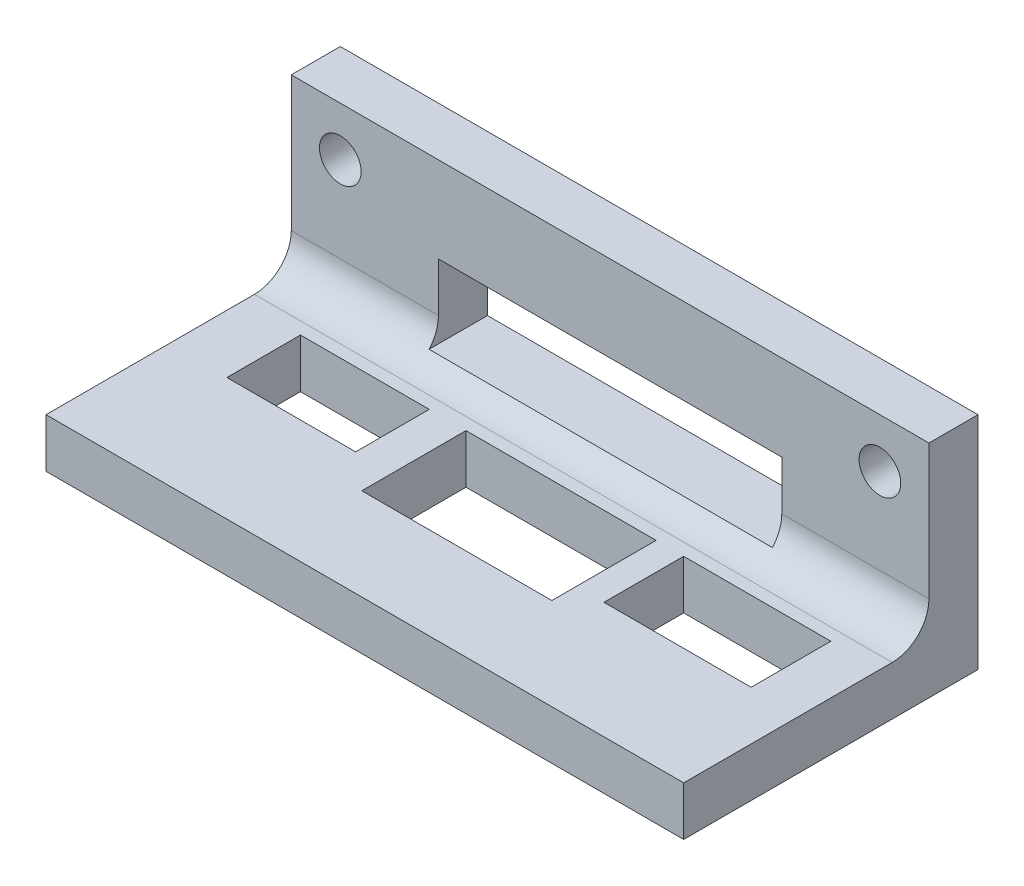
ISO-10303-21;
HEADER;
FILE_DESCRIPTION(('STEP AP214'),'2;1');
FILE_NAME('part.step','',(''),(''),'','','');
FILE_SCHEMA(('AUTOMOTIVE_DESIGN { 1 0 10303 214 1 1 1 1 }'));
ENDSEC;
DATA;
#1=APPLICATION_CONTEXT('core data for automotive mechanical design processes');
#2=APPLICATION_PROTOCOL_DEFINITION('international standard','automotive_design',2000,#1);
#3=PRODUCT_CONTEXT('',#1,'mechanical');
#4=PRODUCT('Part','Part','',(#3));
#5=PRODUCT_RELATED_PRODUCT_CATEGORY('part','',(#4));
#6=PRODUCT_DEFINITION_FORMATION('','',#4);
#7=PRODUCT_DEFINITION_CONTEXT('part definition',#1,'design');
#8=PRODUCT_DEFINITION('design','',#6,#7);
#9=PRODUCT_DEFINITION_SHAPE('','',#8);
#10=(LENGTH_UNIT() NAMED_UNIT(*) SI_UNIT(.MILLI.,.METRE.));
#11=(NAMED_UNIT(*) PLANE_ANGLE_UNIT() SI_UNIT($,.RADIAN.));
#12=(NAMED_UNIT(*) SI_UNIT($,.STERADIAN.) SOLID_ANGLE_UNIT());
#13=UNCERTAINTY_MEASURE_WITH_UNIT(LENGTH_MEASURE(1.E-05),#10,'distance_accuracy_value','');
#14=(GEOMETRIC_REPRESENTATION_CONTEXT(3) GLOBAL_UNCERTAINTY_ASSIGNED_CONTEXT((#13)) GLOBAL_UNIT_ASSIGNED_CONTEXT((#10,
#11,#12)) REPRESENTATION_CONTEXT('',''));
#15=CARTESIAN_POINT('',(0.,0.,0.));
#16=DIRECTION('',(0.,0.,1.));
#17=DIRECTION('',(1.,0.,0.));
#18=AXIS2_PLACEMENT_3D('',#15,#16,#17);
#19=CARTESIAN_POINT('',(-48.,-66.,181.49));
#20=DIRECTION('',(0.,0.,1.));
#21=DIRECTION('',(1.,0.,0.));
#22=AXIS2_PLACEMENT_3D('',#19,#20,#21);
#23=CYLINDRICAL_SURFACE('',#22,1.7);
#24=DIRECTION('',(0.,0.,1.));
#25=VECTOR('',#24,1.);
#26=CARTESIAN_POINT('',(-46.3,-66.,181.49));
#27=LINE('',#26,#25);
#28=CARTESIAN_POINT('',(-46.3,-66.,181.5));
#29=VERTEX_POINT('',#28);
#30=CARTESIAN_POINT('',(-46.3,-66.,185.5));
#31=VERTEX_POINT('',#30);
#32=EDGE_CURVE('E9',#29,#31,#27,.T.);
#33=ORIENTED_EDGE('',*,*,#32,.F.);
#34=CARTESIAN_POINT('',(-48.,-66.,181.5));
#35=DIRECTION('',(0.,0.,1.));
#36=DIRECTION('',(1.,0.,0.));
#37=AXIS2_PLACEMENT_3D('',#34,#35,#36);
#38=CIRCLE('',#37,1.7);
#39=EDGE_CURVE('E270',#29,#29,#38,.T.);
#40=ORIENTED_EDGE('',*,*,#39,.F.);
#41=ORIENTED_EDGE('',*,*,#32,.T.);
#42=CARTESIAN_POINT('',(-48.,-66.,185.5));
#43=DIRECTION('',(0.,0.,1.));
#44=DIRECTION('',(1.,0.,0.));
#45=AXIS2_PLACEMENT_3D('',#42,#43,#44);
#46=CIRCLE('',#45,1.7);
#47=EDGE_CURVE('E251',#31,#31,#46,.T.);
#48=ORIENTED_EDGE('',*,*,#47,.T.);
#49=EDGE_LOOP('',(#33,#40,#41,#48));
#50=FACE_BOUND('',#49,.T.);
#51=ADVANCED_FACE('F14',(#50),#23,.F.);
#52=CARTESIAN_POINT('',(-92.,-66.,181.49));
#53=DIRECTION('',(0.,0.,1.));
#54=DIRECTION('',(1.,0.,0.));
#55=AXIS2_PLACEMENT_3D('',#52,#53,#54);
#56=CYLINDRICAL_SURFACE('',#55,1.7);
#57=DIRECTION('',(0.,0.,1.));
#58=VECTOR('',#57,1.);
#59=CARTESIAN_POINT('',(-90.3,-66.,181.49));
#60=LINE('',#59,#58);
#61=CARTESIAN_POINT('',(-90.3,-66.,181.5));
#62=VERTEX_POINT('',#61);
#63=CARTESIAN_POINT('',(-90.3,-66.,185.5));
#64=VERTEX_POINT('',#63);
#65=EDGE_CURVE('E25',#62,#64,#60,.T.);
#66=ORIENTED_EDGE('',*,*,#65,.F.);
#67=CARTESIAN_POINT('',(-92.,-66.,181.5));
#68=DIRECTION('',(0.,0.,1.));
#69=DIRECTION('',(1.,0.,0.));
#70=AXIS2_PLACEMENT_3D('',#67,#68,#69);
#71=CIRCLE('',#70,1.7);
#72=EDGE_CURVE('E207',#62,#62,#71,.T.);
#73=ORIENTED_EDGE('',*,*,#72,.F.);
#74=ORIENTED_EDGE('',*,*,#65,.T.);
#75=CARTESIAN_POINT('',(-92.,-66.,185.5));
#76=DIRECTION('',(0.,0.,1.));
#77=DIRECTION('',(1.,0.,0.));
#78=AXIS2_PLACEMENT_3D('',#75,#76,#77);
#79=CIRCLE('',#78,1.7);
#80=EDGE_CURVE('E341',#64,#64,#79,.T.);
#81=ORIENTED_EDGE('',*,*,#80,.T.);
#82=EDGE_LOOP('',(#66,#73,#74,#81));
#83=FACE_BOUND('',#82,.T.);
#84=ADVANCED_FACE('F698',(#83),#56,.F.);
#85=CARTESIAN_POINT('',(-84.,-75.,171.5));
#86=DIRECTION('',(1.,0.,0.));
#87=DIRECTION('',(0.,1.,0.));
#88=AXIS2_PLACEMENT_3D('',#85,#86,#87);
#89=PLANE('',#88);
#90=DIRECTION('',(0.,0.,1.));
#91=VECTOR('',#90,1.);
#92=CARTESIAN_POINT('',(-84.,-75.,171.5));
#93=LINE('',#92,#91);
#94=CARTESIAN_POINT('',(-84.,-75.,181.5));
#95=VERTEX_POINT('',#94);
#96=CARTESIAN_POINT('',(-84.,-75.,186.2639320225));
#97=VERTEX_POINT('',#96);
#98=EDGE_CURVE('E230',#95,#97,#93,.T.);
#99=ORIENTED_EDGE('',*,*,#98,.F.);
#100=DIRECTION('',(0.,1.,0.));
#101=VECTOR('',#100,1.);
#102=CARTESIAN_POINT('',(-84.,-77.5,181.5));
#103=LINE('',#102,#101);
#104=CARTESIAN_POINT('',(-84.,-69.,181.5));
#105=VERTEX_POINT('',#104);
#106=EDGE_CURVE('E208',#95,#105,#103,.T.);
#107=ORIENTED_EDGE('',*,*,#106,.T.);
#108=DIRECTION('',(0.,0.,1.));
#109=VECTOR('',#108,1.);
#110=CARTESIAN_POINT('',(-84.,-69.,171.5));
#111=LINE('',#110,#109);
#112=CARTESIAN_POINT('',(-84.,-69.,185.5));
#113=VERTEX_POINT('',#112);
#114=EDGE_CURVE('E280',#105,#113,#111,.T.);
#115=ORIENTED_EDGE('',*,*,#114,.T.);
#116=DIRECTION('',(0.,1.,0.));
#117=VECTOR('',#116,1.);
#118=CARTESIAN_POINT('',(-84.,-77.5,185.5));
#119=LINE('',#118,#117);
#120=CARTESIAN_POINT('',(-84.,-73.,185.5));
#121=VERTEX_POINT('',#120);
#122=EDGE_CURVE('E389',#121,#113,#119,.T.);
#123=ORIENTED_EDGE('',*,*,#122,.F.);
#124=CARTESIAN_POINT('',(-84.,-73.,188.5));
#125=DIRECTION('',(1.,0.,0.));
#126=DIRECTION('',(0.,1.,0.));
#127=AXIS2_PLACEMENT_3D('',#124,#125,#126);
#128=CIRCLE('',#127,3.);
#129=EDGE_CURVE('E260',#97,#121,#128,.T.);
#130=ORIENTED_EDGE('',*,*,#129,.F.);
#131=EDGE_LOOP('',(#99,#107,#115,#123,#130));
#132=FACE_BOUND('',#131,.T.);
#133=ADVANCED_FACE('F457',(#132),#89,.T.);
#134=CARTESIAN_POINT('',(-84.,-69.,171.5));
#135=DIRECTION('',(0.,1.,0.));
#136=DIRECTION('',(1.,0.,0.));
#137=AXIS2_PLACEMENT_3D('',#134,#135,#136);
#138=PLANE('',#137);
#139=DIRECTION('',(-1.,0.,0.));
#140=VECTOR('',#139,1.);
#141=CARTESIAN_POINT('',(-90.,-69.,185.5));
#142=LINE('',#141,#140);
#143=CARTESIAN_POINT('',(-56.,-69.,185.5));
#144=VERTEX_POINT('',#143);
#145=EDGE_CURVE('E286',#144,#113,#142,.T.);
#146=ORIENTED_EDGE('',*,*,#145,.T.);
#147=ORIENTED_EDGE('',*,*,#114,.F.);
#148=DIRECTION('',(-1.,0.,0.));
#149=VECTOR('',#148,1.);
#150=CARTESIAN_POINT('',(-90.,-69.,181.5));
#151=LINE('',#150,#149);
#152=CARTESIAN_POINT('',(-56.,-69.,181.5));
#153=VERTEX_POINT('',#152);
#154=EDGE_CURVE('E368',#153,#105,#151,.T.);
#155=ORIENTED_EDGE('',*,*,#154,.F.);
#156=DIRECTION('',(0.,0.,1.));
#157=VECTOR('',#156,1.);
#158=CARTESIAN_POINT('',(-56.,-69.,171.5));
#159=LINE('',#158,#157);
#160=EDGE_CURVE('E233',#153,#144,#159,.T.);
#161=ORIENTED_EDGE('',*,*,#160,.T.);
#162=EDGE_LOOP('',(#146,#147,#155,#161));
#163=FACE_BOUND('',#162,.T.);
#164=ADVANCED_FACE('F493',(#163),#138,.F.);
#165=CARTESIAN_POINT('',(-56.,-75.,171.5));
#166=DIRECTION('',(1.,0.,0.));
#167=DIRECTION('',(0.,1.,0.));
#168=AXIS2_PLACEMENT_3D('',#165,#166,#167);
#169=PLANE('',#168);
#170=CARTESIAN_POINT('',(-56.,-73.,188.5));
#171=DIRECTION('',(1.,0.,0.));
#172=DIRECTION('',(0.,1.,0.));
#173=AXIS2_PLACEMENT_3D('',#170,#171,#172);
#174=CIRCLE('',#173,3.);
#175=CARTESIAN_POINT('',(-56.,-75.,186.2639320225));
#176=VERTEX_POINT('',#175);
#177=CARTESIAN_POINT('',(-56.,-73.,185.5));
#178=VERTEX_POINT('',#177);
#179=EDGE_CURVE('E250',#176,#178,#174,.T.);
#180=ORIENTED_EDGE('',*,*,#179,.T.);
#181=DIRECTION('',(0.,1.,0.));
#182=VECTOR('',#181,1.);
#183=CARTESIAN_POINT('',(-56.,-77.5,185.5));
#184=LINE('',#183,#182);
#185=EDGE_CURVE('E281',#178,#144,#184,.T.);
#186=ORIENTED_EDGE('',*,*,#185,.T.);
#187=ORIENTED_EDGE('',*,*,#160,.F.);
#188=DIRECTION('',(0.,1.,0.));
#189=VECTOR('',#188,1.);
#190=CARTESIAN_POINT('',(-56.,-77.5,181.5));
#191=LINE('',#190,#189);
#192=CARTESIAN_POINT('',(-56.,-75.,181.5));
#193=VERTEX_POINT('',#192);
#194=EDGE_CURVE('E309',#193,#153,#191,.T.);
#195=ORIENTED_EDGE('',*,*,#194,.F.);
#196=DIRECTION('',(0.,0.,1.));
#197=VECTOR('',#196,1.);
#198=CARTESIAN_POINT('',(-56.,-75.,171.5));
#199=LINE('',#198,#197);
#200=EDGE_CURVE('E234',#193,#176,#199,.T.);
#201=ORIENTED_EDGE('',*,*,#200,.T.);
#202=EDGE_LOOP('',(#180,#186,#187,#195,#201));
#203=FACE_BOUND('',#202,.T.);
#204=ADVANCED_FACE('F498',(#203),#169,.F.);
#205=CARTESIAN_POINT('',(-84.,-75.,171.5));
#206=DIRECTION('',(0.,1.,0.));
#207=DIRECTION('',(1.,0.,0.));
#208=AXIS2_PLACEMENT_3D('',#205,#206,#207);
#209=PLANE('',#208);
#210=ORIENTED_EDGE('',*,*,#200,.F.);
#211=DIRECTION('',(-1.,0.,0.));
#212=VECTOR('',#211,1.);
#213=CARTESIAN_POINT('',(-90.,-75.,181.5));
#214=LINE('',#213,#212);
#215=EDGE_CURVE('E203',#193,#95,#214,.T.);
#216=ORIENTED_EDGE('',*,*,#215,.T.);
#217=ORIENTED_EDGE('',*,*,#98,.T.);
#218=DIRECTION('',(1.,0.,0.));
#219=VECTOR('',#218,1.);
#220=CARTESIAN_POINT('',(-97.,-75.,186.2639320225));
#221=LINE('',#220,#219);
#222=EDGE_CURVE('E256',#97,#176,#221,.T.);
#223=ORIENTED_EDGE('',*,*,#222,.T.);
#224=EDGE_LOOP('',(#210,#216,#217,#223));
#225=FACE_BOUND('',#224,.T.);
#226=ADVANCED_FACE('F462',(#225),#209,.T.);
#227=CARTESIAN_POINT('',(-60.,-83.,189.5));
#228=DIRECTION('',(1.,0.,0.));
#229=DIRECTION('',(0.,1.,0.));
#230=AXIS2_PLACEMENT_3D('',#227,#228,#229);
#231=PLANE('',#230);
#232=DIRECTION('',(0.,1.,0.));
#233=VECTOR('',#232,1.);
#234=CARTESIAN_POINT('',(-60.,-83.,196.));
#235=LINE('',#234,#233);
#236=CARTESIAN_POINT('',(-60.,-80.,196.));
#237=VERTEX_POINT('',#236);
#238=CARTESIAN_POINT('',(-60.,-76.,196.));
#239=VERTEX_POINT('',#238);
#240=EDGE_CURVE('E323',#237,#239,#235,.T.);
#241=ORIENTED_EDGE('',*,*,#240,.F.);
#242=DIRECTION('',(0.,0.,-1.));
#243=VECTOR('',#242,1.);
#244=CARTESIAN_POINT('',(-60.,-80.,185.5));
#245=LINE('',#244,#243);
#246=CARTESIAN_POINT('',(-60.,-80.,189.5));
#247=VERTEX_POINT('',#246);
#248=EDGE_CURVE('E245',#237,#247,#245,.T.);
#249=ORIENTED_EDGE('',*,*,#248,.T.);
#250=DIRECTION('',(0.,1.,0.));
#251=VECTOR('',#250,1.);
#252=CARTESIAN_POINT('',(-60.,-83.,189.5));
#253=LINE('',#252,#251);
#254=CARTESIAN_POINT('',(-60.,-76.,189.5));
#255=VERTEX_POINT('',#254);
#256=EDGE_CURVE('E264',#247,#255,#253,.T.);
#257=ORIENTED_EDGE('',*,*,#256,.T.);
#258=DIRECTION('',(0.,0.,-1.));
#259=VECTOR('',#258,1.);
#260=CARTESIAN_POINT('',(-60.,-76.,185.5));
#261=LINE('',#260,#259);
#262=EDGE_CURVE('E202',#239,#255,#261,.T.);
#263=ORIENTED_EDGE('',*,*,#262,.F.);
#264=EDGE_LOOP('',(#241,#249,#257,#263));
#265=FACE_BOUND('',#264,.T.);
#266=ADVANCED_FACE('F607',(#265),#231,.T.);
#267=CARTESIAN_POINT('',(-60.,-83.,189.5));
#268=DIRECTION('',(0.,0.,1.));
#269=DIRECTION('',(1.,0.,0.));
#270=AXIS2_PLACEMENT_3D('',#267,#268,#269);
#271=PLANE('',#270);
#272=ORIENTED_EDGE('',*,*,#256,.F.);
#273=DIRECTION('',(1.,0.,0.));
#274=VECTOR('',#273,1.);
#275=CARTESIAN_POINT('',(-78.,-80.,189.5));
#276=LINE('',#275,#274);
#277=CARTESIAN_POINT('',(-48.,-80.,189.5));
#278=VERTEX_POINT('',#277);
#279=EDGE_CURVE('E242',#247,#278,#276,.T.);
#280=ORIENTED_EDGE('',*,*,#279,.T.);
#281=DIRECTION('',(0.,1.,0.));
#282=VECTOR('',#281,1.);
#283=CARTESIAN_POINT('',(-48.,-83.,189.5));
#284=LINE('',#283,#282);
#285=CARTESIAN_POINT('',(-48.,-76.,189.5));
#286=VERTEX_POINT('',#285);
#287=EDGE_CURVE('E39',#278,#286,#284,.T.);
#288=ORIENTED_EDGE('',*,*,#287,.T.);
#289=DIRECTION('',(1.,0.,0.));
#290=VECTOR('',#289,1.);
#291=CARTESIAN_POINT('',(-78.,-76.,189.5));
#292=LINE('',#291,#290);
#293=EDGE_CURVE('E212',#255,#286,#292,.T.);
#294=ORIENTED_EDGE('',*,*,#293,.F.);
#295=EDGE_LOOP('',(#272,#280,#288,#294));
#296=FACE_BOUND('',#295,.T.);
#297=ADVANCED_FACE('F731',(#296),#271,.T.);
#298=CARTESIAN_POINT('',(-48.,-83.,189.5));
#299=DIRECTION('',(1.,0.,0.));
#300=DIRECTION('',(0.,1.,0.));
#301=AXIS2_PLACEMENT_3D('',#298,#299,#300);
#302=PLANE('',#301);
#303=DIRECTION('',(0.,0.,-1.));
#304=VECTOR('',#303,1.);
#305=CARTESIAN_POINT('',(-48.,-76.,185.5));
#306=LINE('',#305,#304);
#307=CARTESIAN_POINT('',(-48.,-76.,196.));
#308=VERTEX_POINT('',#307);
#309=EDGE_CURVE('E348',#308,#286,#306,.T.);
#310=ORIENTED_EDGE('',*,*,#309,.T.);
#311=ORIENTED_EDGE('',*,*,#287,.F.);
#312=DIRECTION('',(0.,0.,-1.));
#313=VECTOR('',#312,1.);
#314=CARTESIAN_POINT('',(-48.,-80.,185.5));
#315=LINE('',#314,#313);
#316=CARTESIAN_POINT('',(-48.,-80.,196.));
#317=VERTEX_POINT('',#316);
#318=EDGE_CURVE('E246',#317,#278,#315,.T.);
#319=ORIENTED_EDGE('',*,*,#318,.F.);
#320=DIRECTION('',(0.,1.,0.));
#321=VECTOR('',#320,1.);
#322=CARTESIAN_POINT('',(-48.,-83.,196.));
#323=LINE('',#322,#321);
#324=EDGE_CURVE('E223',#317,#308,#323,.T.);
#325=ORIENTED_EDGE('',*,*,#324,.T.);
#326=EDGE_LOOP('',(#310,#311,#319,#325));
#327=FACE_BOUND('',#326,.T.);
#328=ADVANCED_FACE('F612',(#327),#302,.F.);
#329=CARTESIAN_POINT('',(-60.,-83.,196.));
#330=DIRECTION('',(0.,0.,1.));
#331=DIRECTION('',(1.,0.,0.));
#332=AXIS2_PLACEMENT_3D('',#329,#330,#331);
#333=PLANE('',#332);
#334=DIRECTION('',(1.,0.,0.));
#335=VECTOR('',#334,1.);
#336=CARTESIAN_POINT('',(-78.,-76.,196.));
#337=LINE('',#336,#335);
#338=EDGE_CURVE('E177',#239,#308,#337,.T.);
#339=ORIENTED_EDGE('',*,*,#338,.T.);
#340=ORIENTED_EDGE('',*,*,#324,.F.);
#341=DIRECTION('',(1.,0.,0.));
#342=VECTOR('',#341,1.);
#343=CARTESIAN_POINT('',(-78.,-80.,196.));
#344=LINE('',#343,#342);
#345=EDGE_CURVE('E339',#237,#317,#344,.T.);
#346=ORIENTED_EDGE('',*,*,#345,.F.);
#347=ORIENTED_EDGE('',*,*,#240,.T.);
#348=EDGE_LOOP('',(#339,#340,#346,#347));
#349=FACE_BOUND('',#348,.T.);
#350=ADVANCED_FACE('F602',(#349),#333,.F.);
#351=CARTESIAN_POINT('',(-77.75,-83.,189.5));
#352=DIRECTION('',(0.,0.,1.));
#353=DIRECTION('',(1.,0.,0.));
#354=AXIS2_PLACEMENT_3D('',#351,#352,#353);
#355=PLANE('',#354);
#356=DIRECTION('',(0.,1.,0.));
#357=VECTOR('',#356,1.);
#358=CARTESIAN_POINT('',(-77.75,-83.,189.5));
#359=LINE('',#358,#357);
#360=CARTESIAN_POINT('',(-77.75,-80.,189.5));
#361=VERTEX_POINT('',#360);
#362=CARTESIAN_POINT('',(-77.75,-76.,189.5));
#363=VERTEX_POINT('',#362);
#364=EDGE_CURVE('E224',#361,#363,#359,.T.);
#365=ORIENTED_EDGE('',*,*,#364,.F.);
#366=DIRECTION('',(1.,0.,0.));
#367=VECTOR('',#366,1.);
#368=CARTESIAN_POINT('',(-86.875,-80.,189.5));
#369=LINE('',#368,#367);
#370=CARTESIAN_POINT('',(-62.25,-80.,189.5));
#371=VERTEX_POINT('',#370);
#372=EDGE_CURVE('E481',#361,#371,#369,.T.);
#373=ORIENTED_EDGE('',*,*,#372,.T.);
#374=DIRECTION('',(0.,1.,0.));
#375=VECTOR('',#374,1.);
#376=CARTESIAN_POINT('',(-62.25,-83.,189.5));
#377=LINE('',#376,#375);
#378=CARTESIAN_POINT('',(-62.25,-76.,189.5));
#379=VERTEX_POINT('',#378);
#380=EDGE_CURVE('E219',#371,#379,#377,.T.);
#381=ORIENTED_EDGE('',*,*,#380,.T.);
#382=DIRECTION('',(1.,0.,0.));
#383=VECTOR('',#382,1.);
#384=CARTESIAN_POINT('',(-86.875,-76.,189.5));
#385=LINE('',#384,#383);
#386=EDGE_CURVE('E175',#363,#379,#385,.T.);
#387=ORIENTED_EDGE('',*,*,#386,.F.);
#388=EDGE_LOOP('',(#365,#373,#381,#387));
#389=FACE_BOUND('',#388,.T.);
#390=ADVANCED_FACE('F686',(#389),#355,.T.);
#391=CARTESIAN_POINT('',(-62.25,-83.,189.5));
#392=DIRECTION('',(1.,0.,0.));
#393=DIRECTION('',(0.,1.,0.));
#394=AXIS2_PLACEMENT_3D('',#391,#392,#393);
#395=PLANE('',#394);
#396=DIRECTION('',(0.,0.,-1.));
#397=VECTOR('',#396,1.);
#398=CARTESIAN_POINT('',(-62.25,-76.,185.5));
#399=LINE('',#398,#397);
#400=CARTESIAN_POINT('',(-62.25,-76.,198.));
#401=VERTEX_POINT('',#400);
#402=EDGE_CURVE('E156',#401,#379,#399,.T.);
#403=ORIENTED_EDGE('',*,*,#402,.T.);
#404=ORIENTED_EDGE('',*,*,#380,.F.);
#405=DIRECTION('',(0.,0.,-1.));
#406=VECTOR('',#405,1.);
#407=CARTESIAN_POINT('',(-62.25,-80.,185.5));
#408=LINE('',#407,#406);
#409=CARTESIAN_POINT('',(-62.25,-80.,198.));
#410=VERTEX_POINT('',#409);
#411=EDGE_CURVE('E159',#410,#371,#408,.T.);
#412=ORIENTED_EDGE('',*,*,#411,.F.);
#413=DIRECTION('',(0.,1.,0.));
#414=VECTOR('',#413,1.);
#415=CARTESIAN_POINT('',(-62.25,-83.,198.));
#416=LINE('',#415,#414);
#417=EDGE_CURVE('E152',#410,#401,#416,.T.);
#418=ORIENTED_EDGE('',*,*,#417,.T.);
#419=EDGE_LOOP('',(#403,#404,#412,#418));
#420=FACE_BOUND('',#419,.T.);
#421=ADVANCED_FACE('F154',(#420),#395,.F.);
#422=CARTESIAN_POINT('',(-77.75,-83.,189.5));
#423=DIRECTION('',(1.,0.,0.));
#424=DIRECTION('',(0.,1.,0.));
#425=AXIS2_PLACEMENT_3D('',#422,#423,#424);
#426=PLANE('',#425);
#427=DIRECTION('',(0.,1.,0.));
#428=VECTOR('',#427,1.);
#429=CARTESIAN_POINT('',(-77.75,-83.,198.));
#430=LINE('',#429,#428);
#431=CARTESIAN_POINT('',(-77.75,-80.,198.));
#432=VERTEX_POINT('',#431);
#433=CARTESIAN_POINT('',(-77.75,-76.,198.));
#434=VERTEX_POINT('',#433);
#435=EDGE_CURVE('E165',#432,#434,#430,.T.);
#436=ORIENTED_EDGE('',*,*,#435,.F.);
#437=DIRECTION('',(0.,0.,-1.));
#438=VECTOR('',#437,1.);
#439=CARTESIAN_POINT('',(-77.75,-80.,185.5));
#440=LINE('',#439,#438);
#441=EDGE_CURVE('E273',#432,#361,#440,.T.);
#442=ORIENTED_EDGE('',*,*,#441,.T.);
#443=ORIENTED_EDGE('',*,*,#364,.T.);
#444=DIRECTION('',(0.,0.,-1.));
#445=VECTOR('',#444,1.);
#446=CARTESIAN_POINT('',(-77.75,-76.,185.5));
#447=LINE('',#446,#445);
#448=EDGE_CURVE('E183',#434,#363,#447,.T.);
#449=ORIENTED_EDGE('',*,*,#448,.F.);
#450=EDGE_LOOP('',(#436,#442,#443,#449));
#451=FACE_BOUND('',#450,.T.);
#452=ADVANCED_FACE('F715',(#451),#426,.T.);
#453=CARTESIAN_POINT('',(-77.75,-83.,198.));
#454=DIRECTION('',(0.,0.,1.));
#455=DIRECTION('',(1.,0.,0.));
#456=AXIS2_PLACEMENT_3D('',#453,#454,#455);
#457=PLANE('',#456);
#458=DIRECTION('',(1.,0.,0.));
#459=VECTOR('',#458,1.);
#460=CARTESIAN_POINT('',(-86.875,-76.,198.));
#461=LINE('',#460,#459);
#462=EDGE_CURVE('E173',#434,#401,#461,.T.);
#463=ORIENTED_EDGE('',*,*,#462,.T.);
#464=ORIENTED_EDGE('',*,*,#417,.F.);
#465=DIRECTION('',(1.,0.,0.));
#466=VECTOR('',#465,1.);
#467=CARTESIAN_POINT('',(-86.875,-80.,198.));
#468=LINE('',#467,#466);
#469=EDGE_CURVE('E255',#432,#410,#468,.T.);
#470=ORIENTED_EDGE('',*,*,#469,.F.);
#471=ORIENTED_EDGE('',*,*,#435,.T.);
#472=EDGE_LOOP('',(#463,#464,#470,#471));
#473=FACE_BOUND('',#472,.T.);
#474=ADVANCED_FACE('F179',(#473),#457,.F.);
#475=CARTESIAN_POINT('',(-91.25,-83.,189.5));
#476=DIRECTION('',(0.,0.,1.));
#477=DIRECTION('',(1.,0.,0.));
#478=AXIS2_PLACEMENT_3D('',#475,#476,#477);
#479=PLANE('',#478);
#480=DIRECTION('',(0.,1.,0.));
#481=VECTOR('',#480,1.);
#482=CARTESIAN_POINT('',(-91.25,-83.,189.5));
#483=LINE('',#482,#481);
#484=CARTESIAN_POINT('',(-91.25,-80.,189.5));
#485=VERTEX_POINT('',#484);
#486=CARTESIAN_POINT('',(-91.25,-76.,189.5));
#487=VERTEX_POINT('',#486);
#488=EDGE_CURVE('E320',#485,#487,#483,.T.);
#489=ORIENTED_EDGE('',*,*,#488,.F.);
#490=DIRECTION('',(1.,0.,0.));
#491=VECTOR('',#490,1.);
#492=CARTESIAN_POINT('',(-93.625,-80.,189.5));
#493=LINE('',#492,#491);
#494=CARTESIAN_POINT('',(-80.75,-80.,189.5));
#495=VERTEX_POINT('',#494);
#496=EDGE_CURVE('E336',#485,#495,#493,.T.);
#497=ORIENTED_EDGE('',*,*,#496,.T.);
#498=DIRECTION('',(0.,1.,0.));
#499=VECTOR('',#498,1.);
#500=CARTESIAN_POINT('',(-80.75,-83.,189.5));
#501=LINE('',#500,#499);
#502=CARTESIAN_POINT('',(-80.75,-76.,189.5));
#503=VERTEX_POINT('',#502);
#504=EDGE_CURVE('E166',#495,#503,#501,.T.);
#505=ORIENTED_EDGE('',*,*,#504,.T.);
#506=DIRECTION('',(1.,0.,0.));
#507=VECTOR('',#506,1.);
#508=CARTESIAN_POINT('',(-93.625,-76.,189.5));
#509=LINE('',#508,#507);
#510=EDGE_CURVE('E193',#487,#503,#509,.T.);
#511=ORIENTED_EDGE('',*,*,#510,.F.);
#512=EDGE_LOOP('',(#489,#497,#505,#511));
#513=FACE_BOUND('',#512,.T.);
#514=ADVANCED_FACE('F751',(#513),#479,.T.);
#515=CARTESIAN_POINT('',(-80.75,-83.,189.5));
#516=DIRECTION('',(1.,0.,0.));
#517=DIRECTION('',(0.,1.,0.));
#518=AXIS2_PLACEMENT_3D('',#515,#516,#517);
#519=PLANE('',#518);
#520=DIRECTION('',(0.,0.,-1.));
#521=VECTOR('',#520,1.);
#522=CARTESIAN_POINT('',(-80.75,-76.,185.5));
#523=LINE('',#522,#521);
#524=CARTESIAN_POINT('',(-80.75,-76.,195.5));
#525=VERTEX_POINT('',#524);
#526=EDGE_CURVE('E184',#525,#503,#523,.T.);
#527=ORIENTED_EDGE('',*,*,#526,.T.);
#528=ORIENTED_EDGE('',*,*,#504,.F.);
#529=DIRECTION('',(0.,0.,-1.));
#530=VECTOR('',#529,1.);
#531=CARTESIAN_POINT('',(-80.75,-80.,185.5));
#532=LINE('',#531,#530);
#533=CARTESIAN_POINT('',(-80.75,-80.,195.5));
#534=VERTEX_POINT('',#533);
#535=EDGE_CURVE('E358',#534,#495,#532,.T.);
#536=ORIENTED_EDGE('',*,*,#535,.F.);
#537=DIRECTION('',(0.,1.,0.));
#538=VECTOR('',#537,1.);
#539=CARTESIAN_POINT('',(-80.75,-83.,195.5));
#540=LINE('',#539,#538);
#541=EDGE_CURVE('E213',#534,#525,#540,.T.);
#542=ORIENTED_EDGE('',*,*,#541,.T.);
#543=EDGE_LOOP('',(#527,#528,#536,#542));
#544=FACE_BOUND('',#543,.T.);
#545=ADVANCED_FACE('F673',(#544),#519,.F.);
#546=CARTESIAN_POINT('',(-91.25,-83.,189.5));
#547=DIRECTION('',(1.,0.,0.));
#548=DIRECTION('',(0.,1.,0.));
#549=AXIS2_PLACEMENT_3D('',#546,#547,#548);
#550=PLANE('',#549);
#551=DIRECTION('',(0.,1.,0.));
#552=VECTOR('',#551,1.);
#553=CARTESIAN_POINT('',(-91.25,-83.,195.5));
#554=LINE('',#553,#552);
#555=CARTESIAN_POINT('',(-91.25,-80.,195.5));
#556=VERTEX_POINT('',#555);
#557=CARTESIAN_POINT('',(-91.25,-76.,195.5));
#558=VERTEX_POINT('',#557);
#559=EDGE_CURVE('E217',#556,#558,#554,.T.);
#560=ORIENTED_EDGE('',*,*,#559,.F.);
#561=DIRECTION('',(0.,0.,-1.));
#562=VECTOR('',#561,1.);
#563=CARTESIAN_POINT('',(-91.25,-80.,185.5));
#564=LINE('',#563,#562);
#565=EDGE_CURVE('E331',#556,#485,#564,.T.);
#566=ORIENTED_EDGE('',*,*,#565,.T.);
#567=ORIENTED_EDGE('',*,*,#488,.T.);
#568=DIRECTION('',(0.,0.,-1.));
#569=VECTOR('',#568,1.);
#570=CARTESIAN_POINT('',(-91.25,-76.,185.5));
#571=LINE('',#570,#569);
#572=EDGE_CURVE('E274',#558,#487,#571,.T.);
#573=ORIENTED_EDGE('',*,*,#572,.F.);
#574=EDGE_LOOP('',(#560,#566,#567,#573));
#575=FACE_BOUND('',#574,.T.);
#576=ADVANCED_FACE('F667',(#575),#550,.T.);
#577=CARTESIAN_POINT('',(-91.25,-83.,195.5));
#578=DIRECTION('',(0.,0.,1.));
#579=DIRECTION('',(1.,0.,0.));
#580=AXIS2_PLACEMENT_3D('',#577,#578,#579);
#581=PLANE('',#580);
#582=DIRECTION('',(1.,0.,0.));
#583=VECTOR('',#582,1.);
#584=CARTESIAN_POINT('',(-93.625,-76.,195.5));
#585=LINE('',#584,#583);
#586=EDGE_CURVE('E197',#558,#525,#585,.T.);
#587=ORIENTED_EDGE('',*,*,#586,.T.);
#588=ORIENTED_EDGE('',*,*,#541,.F.);
#589=DIRECTION('',(1.,0.,0.));
#590=VECTOR('',#589,1.);
#591=CARTESIAN_POINT('',(-93.625,-80.,195.5));
#592=LINE('',#591,#590);
#593=EDGE_CURVE('E335',#556,#534,#592,.T.);
#594=ORIENTED_EDGE('',*,*,#593,.F.);
#595=ORIENTED_EDGE('',*,*,#559,.T.);
#596=EDGE_LOOP('',(#587,#588,#594,#595));
#597=FACE_BOUND('',#596,.T.);
#598=ADVANCED_FACE('F672',(#597),#581,.F.);
#599=CARTESIAN_POINT('',(-44.,-80.,181.5));
#600=DIRECTION('',(1.,0.,0.));
#601=DIRECTION('',(0.,1.,0.));
#602=AXIS2_PLACEMENT_3D('',#599,#600,#601);
#603=PLANE('',#602);
#604=DIRECTION('',(0.,0.,1.));
#605=VECTOR('',#604,1.);
#606=CARTESIAN_POINT('',(-44.,-80.,181.5));
#607=LINE('',#606,#605);
#608=CARTESIAN_POINT('',(-44.,-80.,181.5));
#609=VERTEX_POINT('',#608);
#610=CARTESIAN_POINT('',(-44.,-80.,205.5));
#611=VERTEX_POINT('',#610);
#612=EDGE_CURVE('E240',#609,#611,#607,.T.);
#613=ORIENTED_EDGE('',*,*,#612,.F.);
#614=DIRECTION('',(0.,-1.,0.));
#615=VECTOR('',#614,1.);
#616=CARTESIAN_POINT('',(-44.,-62.,181.5));
#617=LINE('',#616,#615);
#618=CARTESIAN_POINT('',(-44.,-62.,181.5));
#619=VERTEX_POINT('',#618);
#620=EDGE_CURVE('E305',#619,#609,#617,.T.);
#621=ORIENTED_EDGE('',*,*,#620,.F.);
#622=DIRECTION('',(0.,0.,1.));
#623=VECTOR('',#622,1.);
#624=CARTESIAN_POINT('',(-44.,-62.,181.5));
#625=LINE('',#624,#623);
#626=CARTESIAN_POINT('',(-44.,-62.,185.5));
#627=VERTEX_POINT('',#626);
#628=EDGE_CURVE('E269',#619,#627,#625,.T.);
#629=ORIENTED_EDGE('',*,*,#628,.T.);
#630=DIRECTION('',(0.,1.,0.));
#631=VECTOR('',#630,1.);
#632=CARTESIAN_POINT('',(-44.,-80.,185.5));
#633=LINE('',#632,#631);
#634=CARTESIAN_POINT('',(-44.,-73.,185.5));
#635=VERTEX_POINT('',#634);
#636=EDGE_CURVE('E329',#635,#627,#633,.T.);
#637=ORIENTED_EDGE('',*,*,#636,.F.);
#638=CARTESIAN_POINT('',(-44.,-73.,188.5));
#639=DIRECTION('',(1.,0.,0.));
#640=DIRECTION('',(0.,1.,0.));
#641=AXIS2_PLACEMENT_3D('',#638,#639,#640);
#642=CIRCLE('',#641,3.);
#643=CARTESIAN_POINT('',(-44.,-76.,188.5));
#644=VERTEX_POINT('',#643);
#645=EDGE_CURVE('E247',#644,#635,#642,.T.);
#646=ORIENTED_EDGE('',*,*,#645,.F.);
#647=DIRECTION('',(0.,0.,1.));
#648=VECTOR('',#647,1.);
#649=CARTESIAN_POINT('',(-44.,-76.,181.5));
#650=LINE('',#649,#648);
#651=CARTESIAN_POINT('',(-44.,-76.,205.5));
#652=VERTEX_POINT('',#651);
#653=EDGE_CURVE('E311',#644,#652,#650,.T.);
#654=ORIENTED_EDGE('',*,*,#653,.T.);
#655=DIRECTION('',(0.,1.,0.));
#656=VECTOR('',#655,1.);
#657=CARTESIAN_POINT('',(-44.,-80.,205.5));
#658=LINE('',#657,#656);
#659=EDGE_CURVE('E218',#611,#652,#658,.T.);
#660=ORIENTED_EDGE('',*,*,#659,.F.);
#661=EDGE_LOOP('',(#613,#621,#629,#637,#646,#654,#660));
#662=FACE_BOUND('',#661,.T.);
#663=ADVANCED_FACE('F505',(#662),#603,.T.);
#664=CARTESIAN_POINT('',(-96.,-80.,205.5));
#665=DIRECTION('',(0.,0.,1.));
#666=DIRECTION('',(1.,0.,0.));
#667=AXIS2_PLACEMENT_3D('',#664,#665,#666);
#668=PLANE('',#667);
#669=DIRECTION('',(0.,1.,0.));
#670=VECTOR('',#669,1.);
#671=CARTESIAN_POINT('',(-96.,-80.,205.5));
#672=LINE('',#671,#670);
#673=CARTESIAN_POINT('',(-96.,-80.,205.5));
#674=VERTEX_POINT('',#673);
#675=CARTESIAN_POINT('',(-96.,-76.,205.5));
#676=VERTEX_POINT('',#675);
#677=EDGE_CURVE('E225',#674,#676,#672,.T.);
#678=ORIENTED_EDGE('',*,*,#677,.F.);
#679=DIRECTION('',(1.,0.,0.));
#680=VECTOR('',#679,1.);
#681=CARTESIAN_POINT('',(-96.,-80.,205.5));
#682=LINE('',#681,#680);
#683=EDGE_CURVE('E296',#674,#611,#682,.T.);
#684=ORIENTED_EDGE('',*,*,#683,.T.);
#685=ORIENTED_EDGE('',*,*,#659,.T.);
#686=DIRECTION('',(1.,0.,0.));
#687=VECTOR('',#686,1.);
#688=CARTESIAN_POINT('',(-96.,-76.,205.5));
#689=LINE('',#688,#687);
#690=EDGE_CURVE('E315',#676,#652,#689,.T.);
#691=ORIENTED_EDGE('',*,*,#690,.F.);
#692=EDGE_LOOP('',(#678,#684,#685,#691));
#693=FACE_BOUND('',#692,.T.);
#694=ADVANCED_FACE('F16',(#693),#668,.T.);
#695=CARTESIAN_POINT('',(-96.,-76.,181.5));
#696=DIRECTION('',(0.,1.,0.));
#697=DIRECTION('',(1.,0.,0.));
#698=AXIS2_PLACEMENT_3D('',#695,#696,#697);
#699=PLANE('',#698);
#700=ORIENTED_EDGE('',*,*,#338,.F.);
#701=ORIENTED_EDGE('',*,*,#262,.T.);
#702=ORIENTED_EDGE('',*,*,#293,.T.);
#703=ORIENTED_EDGE('',*,*,#309,.F.);
#704=EDGE_LOOP('',(#700,#701,#702,#703));
#705=FACE_BOUND('',#704,.T.);
#706=ORIENTED_EDGE('',*,*,#462,.F.);
#707=ORIENTED_EDGE('',*,*,#448,.T.);
#708=ORIENTED_EDGE('',*,*,#386,.T.);
#709=ORIENTED_EDGE('',*,*,#402,.F.);
#710=EDGE_LOOP('',(#706,#707,#708,#709));
#711=FACE_BOUND('',#710,.T.);
#712=ORIENTED_EDGE('',*,*,#586,.F.);
#713=ORIENTED_EDGE('',*,*,#572,.T.);
#714=ORIENTED_EDGE('',*,*,#510,.T.);
#715=ORIENTED_EDGE('',*,*,#526,.F.);
#716=EDGE_LOOP('',(#712,#713,#714,#715));
#717=FACE_BOUND('',#716,.T.);
#718=ORIENTED_EDGE('',*,*,#653,.F.);
#719=DIRECTION('',(1.,0.,0.));
#720=VECTOR('',#719,1.);
#721=CARTESIAN_POINT('',(-97.,-76.,188.5));
#722=LINE('',#721,#720);
#723=CARTESIAN_POINT('',(-96.,-76.,188.5));
#724=VERTEX_POINT('',#723);
#725=EDGE_CURVE('E316',#724,#644,#722,.T.);
#726=ORIENTED_EDGE('',*,*,#725,.F.);
#727=DIRECTION('',(0.,0.,1.));
#728=VECTOR('',#727,1.);
#729=CARTESIAN_POINT('',(-96.,-76.,181.5));
#730=LINE('',#729,#728);
#731=EDGE_CURVE('E229',#724,#676,#730,.T.);
#732=ORIENTED_EDGE('',*,*,#731,.T.);
#733=ORIENTED_EDGE('',*,*,#690,.T.);
#734=EDGE_LOOP('',(#718,#726,#732,#733));
#735=FACE_BOUND('',#734,.T.);
#736=ADVANCED_FACE('F170',(#705,#711,#717,#735),#699,.T.);
#737=CARTESIAN_POINT('',(-97.,-73.,188.5));
#738=DIRECTION('',(1.,0.,0.));
#739=DIRECTION('',(0.,1.,0.));
#740=AXIS2_PLACEMENT_3D('',#737,#738,#739);
#741=CYLINDRICAL_SURFACE('',#740,3.);
#742=ORIENTED_EDGE('',*,*,#645,.T.);
#743=DIRECTION('',(1.,0.,0.));
#744=VECTOR('',#743,1.);
#745=CARTESIAN_POINT('',(-97.,-73.,185.5));
#746=LINE('',#745,#744);
#747=EDGE_CURVE('E285',#178,#635,#746,.T.);
#748=ORIENTED_EDGE('',*,*,#747,.F.);
#749=ORIENTED_EDGE('',*,*,#179,.F.);
#750=ORIENTED_EDGE('',*,*,#222,.F.);
#751=ORIENTED_EDGE('',*,*,#129,.T.);
#752=DIRECTION('',(1.,0.,0.));
#753=VECTOR('',#752,1.);
#754=CARTESIAN_POINT('',(-97.,-73.,185.5));
#755=LINE('',#754,#753);
#756=CARTESIAN_POINT('',(-96.,-73.,185.5));
#757=VERTEX_POINT('',#756);
#758=EDGE_CURVE('E18',#757,#121,#755,.T.);
#759=ORIENTED_EDGE('',*,*,#758,.F.);
#760=CARTESIAN_POINT('',(-96.,-73.,188.5));
#761=DIRECTION('',(1.,0.,0.));
#762=DIRECTION('',(0.,1.,0.));
#763=AXIS2_PLACEMENT_3D('',#760,#761,#762);
#764=CIRCLE('',#763,3.);
#765=EDGE_CURVE('E301',#724,#757,#764,.T.);
#766=ORIENTED_EDGE('',*,*,#765,.F.);
#767=ORIENTED_EDGE('',*,*,#725,.T.);
#768=EDGE_LOOP('',(#742,#748,#749,#750,#751,#759,#766,#767));
#769=FACE_BOUND('',#768,.T.);
#770=ADVANCED_FACE('F429',(#769),#741,.F.);
#771=CARTESIAN_POINT('',(-96.,-80.,185.5));
#772=DIRECTION('',(0.,0.,1.));
#773=DIRECTION('',(1.,0.,0.));
#774=AXIS2_PLACEMENT_3D('',#771,#772,#773);
#775=PLANE('',#774);
#776=ORIENTED_EDGE('',*,*,#47,.F.);
#777=EDGE_LOOP('',(#776));
#778=FACE_BOUND('',#777,.T.);
#779=ORIENTED_EDGE('',*,*,#80,.F.);
#780=EDGE_LOOP('',(#779));
#781=FACE_BOUND('',#780,.T.);
#782=DIRECTION('',(0.,1.,0.));
#783=VECTOR('',#782,1.);
#784=CARTESIAN_POINT('',(-96.,-80.,185.5));
#785=LINE('',#784,#783);
#786=CARTESIAN_POINT('',(-96.,-62.,185.5));
#787=VERTEX_POINT('',#786);
#788=EDGE_CURVE('E425',#757,#787,#785,.T.);
#789=ORIENTED_EDGE('',*,*,#788,.F.);
#790=ORIENTED_EDGE('',*,*,#758,.T.);
#791=ORIENTED_EDGE('',*,*,#122,.T.);
#792=ORIENTED_EDGE('',*,*,#145,.F.);
#793=ORIENTED_EDGE('',*,*,#185,.F.);
#794=ORIENTED_EDGE('',*,*,#747,.T.);
#795=ORIENTED_EDGE('',*,*,#636,.T.);
#796=DIRECTION('',(1.,0.,0.));
#797=VECTOR('',#796,1.);
#798=CARTESIAN_POINT('',(-96.,-62.,185.5));
#799=LINE('',#798,#797);
#800=EDGE_CURVE('E265',#787,#627,#799,.T.);
#801=ORIENTED_EDGE('',*,*,#800,.F.);
#802=EDGE_LOOP('',(#789,#790,#791,#792,#793,#794,#795,#801));
#803=FACE_BOUND('',#802,.T.);
#804=ADVANCED_FACE('F421',(#778,#781,#803),#775,.T.);
#805=CARTESIAN_POINT('',(-96.,-62.,181.5));
#806=DIRECTION('',(0.,1.,0.));
#807=DIRECTION('',(1.,0.,0.));
#808=AXIS2_PLACEMENT_3D('',#805,#806,#807);
#809=PLANE('',#808);
#810=DIRECTION('',(1.,0.,0.));
#811=VECTOR('',#810,1.);
#812=CARTESIAN_POINT('',(-96.,-62.,181.5));
#813=LINE('',#812,#811);
#814=CARTESIAN_POINT('',(-96.,-62.,181.5));
#815=VERTEX_POINT('',#814);
#816=EDGE_CURVE('E310',#815,#619,#813,.T.);
#817=ORIENTED_EDGE('',*,*,#816,.F.);
#818=DIRECTION('',(0.,0.,1.));
#819=VECTOR('',#818,1.);
#820=CARTESIAN_POINT('',(-96.,-62.,181.5));
#821=LINE('',#820,#819);
#822=EDGE_CURVE('E293',#815,#787,#821,.T.);
#823=ORIENTED_EDGE('',*,*,#822,.T.);
#824=ORIENTED_EDGE('',*,*,#800,.T.);
#825=ORIENTED_EDGE('',*,*,#628,.F.);
#826=EDGE_LOOP('',(#817,#823,#824,#825));
#827=FACE_BOUND('',#826,.T.);
#828=ADVANCED_FACE('F551',(#827),#809,.T.);
#829=CARTESIAN_POINT('',(-96.,-80.,181.5));
#830=DIRECTION('',(0.,0.,1.));
#831=DIRECTION('',(1.,0.,0.));
#832=AXIS2_PLACEMENT_3D('',#829,#830,#831);
#833=PLANE('',#832);
#834=ORIENTED_EDGE('',*,*,#39,.T.);
#835=EDGE_LOOP('',(#834));
#836=FACE_BOUND('',#835,.T.);
#837=ORIENTED_EDGE('',*,*,#72,.T.);
#838=EDGE_LOOP('',(#837));
#839=FACE_BOUND('',#838,.T.);
#840=ORIENTED_EDGE('',*,*,#194,.T.);
#841=ORIENTED_EDGE('',*,*,#154,.T.);
#842=ORIENTED_EDGE('',*,*,#106,.F.);
#843=ORIENTED_EDGE('',*,*,#215,.F.);
#844=EDGE_LOOP('',(#840,#841,#842,#843));
#845=FACE_BOUND('',#844,.T.);
#846=DIRECTION('',(0.,-1.,0.));
#847=VECTOR('',#846,1.);
#848=CARTESIAN_POINT('',(-96.,-62.,181.5));
#849=LINE('',#848,#847);
#850=CARTESIAN_POINT('',(-96.,-80.,181.5));
#851=VERTEX_POINT('',#850);
#852=EDGE_CURVE('E241',#815,#851,#849,.T.);
#853=ORIENTED_EDGE('',*,*,#852,.F.);
#854=ORIENTED_EDGE('',*,*,#816,.T.);
#855=ORIENTED_EDGE('',*,*,#620,.T.);
#856=DIRECTION('',(1.,0.,0.));
#857=VECTOR('',#856,1.);
#858=CARTESIAN_POINT('',(-96.,-80.,181.5));
#859=LINE('',#858,#857);
#860=EDGE_CURVE('E354',#851,#609,#859,.T.);
#861=ORIENTED_EDGE('',*,*,#860,.F.);
#862=EDGE_LOOP('',(#853,#854,#855,#861));
#863=FACE_BOUND('',#862,.T.);
#864=ADVANCED_FACE('F465',(#836,#839,#845,#863),#833,.F.);
#865=CARTESIAN_POINT('',(-96.,-80.,181.5));
#866=DIRECTION('',(0.,1.,0.));
#867=DIRECTION('',(1.,0.,0.));
#868=AXIS2_PLACEMENT_3D('',#865,#866,#867);
#869=PLANE('',#868);
#870=ORIENTED_EDGE('',*,*,#318,.T.);
#871=ORIENTED_EDGE('',*,*,#279,.F.);
#872=ORIENTED_EDGE('',*,*,#248,.F.);
#873=ORIENTED_EDGE('',*,*,#345,.T.);
#874=EDGE_LOOP('',(#870,#871,#872,#873));
#875=FACE_BOUND('',#874,.T.);
#876=ORIENTED_EDGE('',*,*,#411,.T.);
#877=ORIENTED_EDGE('',*,*,#372,.F.);
#878=ORIENTED_EDGE('',*,*,#441,.F.);
#879=ORIENTED_EDGE('',*,*,#469,.T.);
#880=EDGE_LOOP('',(#876,#877,#878,#879));
#881=FACE_BOUND('',#880,.T.);
#882=ORIENTED_EDGE('',*,*,#535,.T.);
#883=ORIENTED_EDGE('',*,*,#496,.F.);
#884=ORIENTED_EDGE('',*,*,#565,.F.);
#885=ORIENTED_EDGE('',*,*,#593,.T.);
#886=EDGE_LOOP('',(#882,#883,#884,#885));
#887=FACE_BOUND('',#886,.T.);
#888=ORIENTED_EDGE('',*,*,#612,.T.);
#889=ORIENTED_EDGE('',*,*,#683,.F.);
#890=DIRECTION('',(0.,0.,1.));
#891=VECTOR('',#890,1.);
#892=CARTESIAN_POINT('',(-96.,-80.,181.5));
#893=LINE('',#892,#891);
#894=EDGE_CURVE('E236',#851,#674,#893,.T.);
#895=ORIENTED_EDGE('',*,*,#894,.F.);
#896=ORIENTED_EDGE('',*,*,#860,.T.);
#897=EDGE_LOOP('',(#888,#889,#895,#896));
#898=FACE_BOUND('',#897,.T.);
#899=ADVANCED_FACE('F615',(#875,#881,#887,#898),#869,.F.);
#900=CARTESIAN_POINT('',(-96.,-80.,181.5));
#901=DIRECTION('',(1.,0.,0.));
#902=DIRECTION('',(0.,1.,0.));
#903=AXIS2_PLACEMENT_3D('',#900,#901,#902);
#904=PLANE('',#903);
#905=ORIENTED_EDGE('',*,*,#677,.T.);
#906=ORIENTED_EDGE('',*,*,#731,.F.);
#907=ORIENTED_EDGE('',*,*,#765,.T.);
#908=ORIENTED_EDGE('',*,*,#788,.T.);
#909=ORIENTED_EDGE('',*,*,#822,.F.);
#910=ORIENTED_EDGE('',*,*,#852,.T.);
#911=ORIENTED_EDGE('',*,*,#894,.T.);
#912=EDGE_LOOP('',(#905,#906,#907,#908,#909,#910,#911));
#913=FACE_BOUND('',#912,.T.);
#914=ADVANCED_FACE('F556',(#913),#904,.F.);
#915=CLOSED_SHELL('',(#51,#84,#133,#164,#204,#226,#266,#297,#328,#350,#390,#421,#452,#474,#514,
#545,#576,#598,#663,#694,#736,#770,#804,#828,#864,#899,#914));
#916=MANIFOLD_SOLID_BREP('B1',#915);
#917=ADVANCED_BREP_SHAPE_REPRESENTATION('',(#18,#916),#14);
#918=SHAPE_DEFINITION_REPRESENTATION(#9,#917);
ENDSEC;
END-ISO-10303-21;
